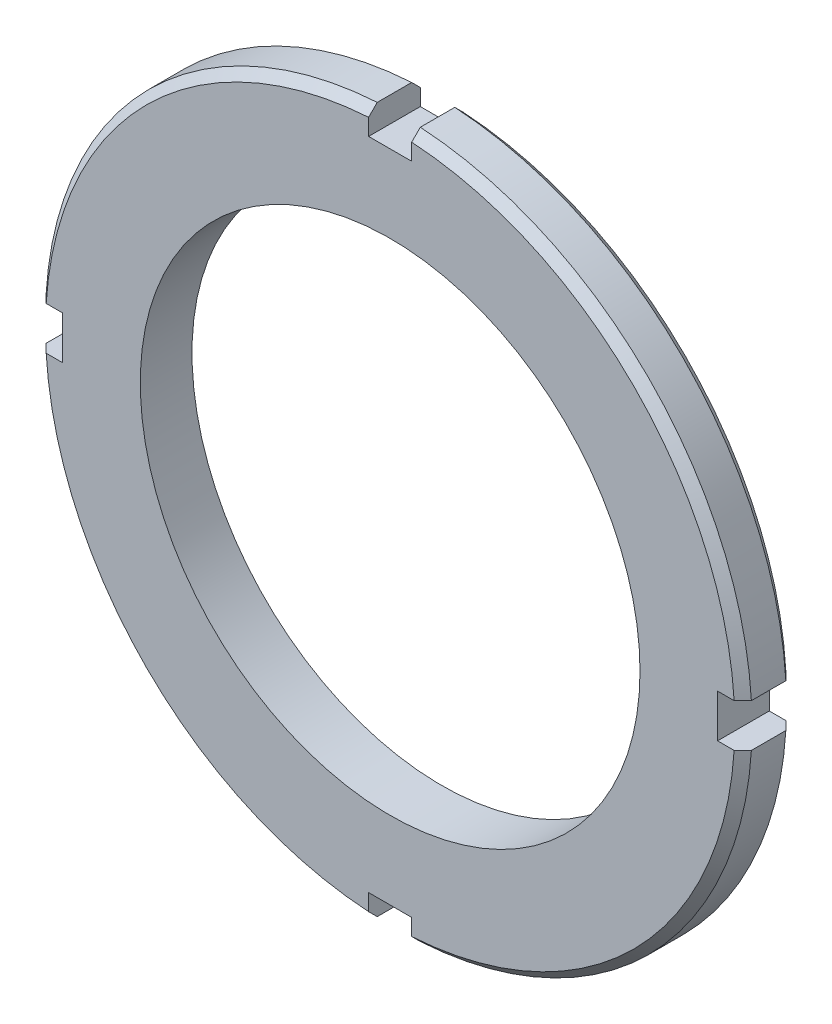
ISO-10303-21;
HEADER;
FILE_DESCRIPTION(('STEP AP214'),'2;1');
FILE_NAME('part.step','',(''),(''),'','','');
FILE_SCHEMA(('AUTOMOTIVE_DESIGN { 1 0 10303 214 1 1 1 1 }'));
ENDSEC;
DATA;
#1=APPLICATION_CONTEXT('core data for automotive mechanical design processes');
#2=APPLICATION_PROTOCOL_DEFINITION('international standard','automotive_design',2000,#1);
#3=PRODUCT_CONTEXT('',#1,'mechanical');
#4=PRODUCT('Part','Part','',(#3));
#5=PRODUCT_RELATED_PRODUCT_CATEGORY('part','',(#4));
#6=PRODUCT_DEFINITION_FORMATION('','',#4);
#7=PRODUCT_DEFINITION_CONTEXT('part definition',#1,'design');
#8=PRODUCT_DEFINITION('design','',#6,#7);
#9=PRODUCT_DEFINITION_SHAPE('','',#8);
#10=(LENGTH_UNIT() NAMED_UNIT(*) SI_UNIT(.MILLI.,.METRE.));
#11=(NAMED_UNIT(*) PLANE_ANGLE_UNIT() SI_UNIT($,.RADIAN.));
#12=(NAMED_UNIT(*) SI_UNIT($,.STERADIAN.) SOLID_ANGLE_UNIT());
#13=UNCERTAINTY_MEASURE_WITH_UNIT(LENGTH_MEASURE(1.E-05),#10,'distance_accuracy_value','');
#14=(GEOMETRIC_REPRESENTATION_CONTEXT(3) GLOBAL_UNCERTAINTY_ASSIGNED_CONTEXT((#13)) GLOBAL_UNIT_ASSIGNED_CONTEXT((#10,
#11,#12)) REPRESENTATION_CONTEXT('',''));
#15=CARTESIAN_POINT('',(0.,0.,0.));
#16=DIRECTION('',(0.,0.,1.));
#17=DIRECTION('',(1.,0.,0.));
#18=AXIS2_PLACEMENT_3D('',#15,#16,#17);
#19=CARTESIAN_POINT('',(0.,0.,6.));
#20=DIRECTION('',(0.,0.,-1.));
#21=DIRECTION('',(-1.,0.,0.));
#22=AXIS2_PLACEMENT_3D('',#19,#20,#21);
#23=CYLINDRICAL_SURFACE('',#22,41.);
#24=CARTESIAN_POINT('',(0.,0.,0.999999999999994));
#25=DIRECTION('',(0.,0.,1.));
#26=DIRECTION('',(1.,0.,0.));
#27=AXIS2_PLACEMENT_3D('',#24,#25,#26);
#28=CIRCLE('',#27,41.);
#29=CARTESIAN_POINT('',(40.9237095092808,2.5,0.999999999999994));
#30=VERTEX_POINT('',#29);
#31=CARTESIAN_POINT('',(2.49999999999986,40.9237095092808,0.999999999999994));
#32=VERTEX_POINT('',#31);
#33=EDGE_CURVE('E513',#30,#32,#28,.T.);
#34=ORIENTED_EDGE('',*,*,#33,.T.);
#35=DIRECTION('',(0.,0.,-1.));
#36=VECTOR('',#35,1.);
#37=CARTESIAN_POINT('',(2.49999999999986,40.9237095092808,6.));
#38=LINE('',#37,#36);
#39=CARTESIAN_POINT('',(2.49999999999986,40.9237095092808,5.00000000000001));
#40=VERTEX_POINT('',#39);
#41=EDGE_CURVE('E806',#32,#40,#38,.F.);
#42=ORIENTED_EDGE('',*,*,#41,.T.);
#43=CARTESIAN_POINT('',(0.,0.,5.00000000000001));
#44=DIRECTION('',(0.,0.,1.));
#45=DIRECTION('',(1.,0.,0.));
#46=AXIS2_PLACEMENT_3D('',#43,#44,#45);
#47=CIRCLE('',#46,41.);
#48=CARTESIAN_POINT('',(40.9237095092808,2.5,5.00000000000001));
#49=VERTEX_POINT('',#48);
#50=EDGE_CURVE('E507',#40,#49,#47,.F.);
#51=ORIENTED_EDGE('',*,*,#50,.T.);
#52=DIRECTION('',(0.,0.,-1.));
#53=VECTOR('',#52,1.);
#54=CARTESIAN_POINT('',(40.9237095092808,2.5,6.));
#55=LINE('',#54,#53);
#56=EDGE_CURVE('E487',#49,#30,#55,.T.);
#57=ORIENTED_EDGE('',*,*,#56,.T.);
#58=EDGE_LOOP('',(#34,#42,#51,#57));
#59=FACE_BOUND('',#58,.T.);
#60=ADVANCED_FACE('F53',(#59),#23,.T.);
#61=CARTESIAN_POINT('',(-40.9237095092808,2.5,5.00000000000001));
#62=VERTEX_POINT('',#61);
#63=CARTESIAN_POINT('',(-2.50000000000014,40.9237095092808,5.00000000000001));
#64=VERTEX_POINT('',#63);
#65=EDGE_CURVE('E841',#62,#64,#47,.F.);
#66=ORIENTED_EDGE('',*,*,#65,.T.);
#67=DIRECTION('',(0.,0.,-1.));
#68=VECTOR('',#67,1.);
#69=CARTESIAN_POINT('',(-2.50000000000014,40.9237095092808,6.));
#70=LINE('',#69,#68);
#71=CARTESIAN_POINT('',(-2.50000000000014,40.9237095092808,0.999999999999994));
#72=VERTEX_POINT('',#71);
#73=EDGE_CURVE('E76',#64,#72,#70,.T.);
#74=ORIENTED_EDGE('',*,*,#73,.T.);
#75=CARTESIAN_POINT('',(-40.9237095092808,2.5,0.999999999999994));
#76=VERTEX_POINT('',#75);
#77=EDGE_CURVE('E517',#72,#76,#28,.T.);
#78=ORIENTED_EDGE('',*,*,#77,.T.);
#79=DIRECTION('',(0.,0.,-1.));
#80=VECTOR('',#79,1.);
#81=CARTESIAN_POINT('',(-40.9237095092808,2.5,6.));
#82=LINE('',#81,#80);
#83=EDGE_CURVE('E405',#76,#62,#82,.F.);
#84=ORIENTED_EDGE('',*,*,#83,.T.);
#85=EDGE_LOOP('',(#66,#74,#78,#84));
#86=FACE_BOUND('',#85,.T.);
#87=ADVANCED_FACE('F608',(#86),#23,.T.);
#88=CARTESIAN_POINT('',(-2.49999999999957,-40.9237095092808,5.));
#89=VERTEX_POINT('',#88);
#90=CARTESIAN_POINT('',(-40.9237095092808,-2.5,5.00000000000001));
#91=VERTEX_POINT('',#90);
#92=EDGE_CURVE('E512',#89,#91,#47,.F.);
#93=ORIENTED_EDGE('',*,*,#92,.T.);
#94=DIRECTION('',(0.,0.,-1.));
#95=VECTOR('',#94,1.);
#96=CARTESIAN_POINT('',(-40.9237095092808,-2.5,6.));
#97=LINE('',#96,#95);
#98=CARTESIAN_POINT('',(-40.9237095092808,-2.5,0.999999999999994));
#99=VERTEX_POINT('',#98);
#100=EDGE_CURVE('E84',#91,#99,#97,.T.);
#101=ORIENTED_EDGE('',*,*,#100,.T.);
#102=CARTESIAN_POINT('',(-2.49999999999957,-40.9237095092808,0.999999999999994));
#103=VERTEX_POINT('',#102);
#104=EDGE_CURVE('E525',#99,#103,#28,.T.);
#105=ORIENTED_EDGE('',*,*,#104,.T.);
#106=DIRECTION('',(0.,0.,-1.));
#107=VECTOR('',#106,1.);
#108=CARTESIAN_POINT('',(-2.49999999999957,-40.9237095092808,6.));
#109=LINE('',#108,#107);
#110=EDGE_CURVE('E332',#103,#89,#109,.F.);
#111=ORIENTED_EDGE('',*,*,#110,.T.);
#112=EDGE_LOOP('',(#93,#101,#105,#111));
#113=FACE_BOUND('',#112,.T.);
#114=ADVANCED_FACE('F536',(#113),#23,.T.);
#115=CARTESIAN_POINT('',(0.,0.,0.999999999999994));
#116=DIRECTION('',(0.,0.,1.));
#117=DIRECTION('',(1.,0.,0.));
#118=AXIS2_PLACEMENT_3D('',#115,#116,#117);
#119=CONICAL_SURFACE('',#118,41.,0.785398163397452);
#120=CARTESIAN_POINT('',(2.49999999999985,44.0916594503413,4.16247766016836));
#121=CARTESIAN_POINT('',(2.49999999999985,42.8686945131576,2.94143846954862));
#122=CARTESIAN_POINT('',(2.49999999999986,41.6456231286787,1.72050593129695));
#123=CARTESIAN_POINT('',(2.49999999999986,39.1992674634485,-0.72114584214892));
#124=CARTESIAN_POINT('',(2.49999999999987,37.975983182697,-1.94186507734283));
#125=CARTESIAN_POINT('',(2.49999999999987,36.75259245465,-3.16247766016837));
#126=B_SPLINE_CURVE_WITH_KNOTS('',3,(#120,#121,#122,#123,#124,#125),.UNSPECIFIED.,.F.,.F.,(4,2,
4),(0.,5.18451722636114,10.3690344598512),.UNSPECIFIED.);
#127=CARTESIAN_POINT('',(2.49999999999986,39.9217985566783,0.));
#128=VERTEX_POINT('',#127);
#129=EDGE_CURVE('E797',#32,#128,#126,.T.);
#130=ORIENTED_EDGE('',*,*,#129,.F.);
#131=ORIENTED_EDGE('',*,*,#33,.F.);
#132=CARTESIAN_POINT('',(36.7525924546499,2.5,-3.16247766016838));
#133=CARTESIAN_POINT('',(37.975983182697,2.5,-1.94186507734283));
#134=CARTESIAN_POINT('',(39.1992674634485,2.5,-0.72114584214892));
#135=CARTESIAN_POINT('',(41.6456231286787,2.5,1.72050593129696));
#136=CARTESIAN_POINT('',(42.8686945131576,2.5,2.94143846954862));
#137=CARTESIAN_POINT('',(44.0916594503413,2.5,4.16247766016837));
#138=B_SPLINE_CURVE_WITH_KNOTS('',3,(#132,#133,#134,#135,#136,#137),.UNSPECIFIED.,.F.,.F.,(4,2,
4),(0.,5.18451723349012,10.3690344598513),.UNSPECIFIED.);
#139=CARTESIAN_POINT('',(39.9217985566783,2.5,0.));
#140=VERTEX_POINT('',#139);
#141=EDGE_CURVE('E478',#140,#30,#138,.T.);
#142=ORIENTED_EDGE('',*,*,#141,.F.);
#143=CARTESIAN_POINT('',(0.,0.,0.));
#144=DIRECTION('',(0.,0.,1.));
#145=DIRECTION('',(1.,0.,0.));
#146=AXIS2_PLACEMENT_3D('',#143,#144,#145);
#147=CIRCLE('',#146,40.);
#148=EDGE_CURVE('E516',#128,#140,#147,.F.);
#149=ORIENTED_EDGE('',*,*,#148,.F.);
#150=EDGE_LOOP('',(#130,#131,#142,#149));
#151=FACE_BOUND('',#150,.T.);
#152=ADVANCED_FACE('F596',(#151),#119,.T.);
#153=CARTESIAN_POINT('',(-2.50000000000013,36.7525924546499,-3.16247766016838));
#154=CARTESIAN_POINT('',(-2.50000000000013,37.975983182697,-1.94186507734284));
#155=CARTESIAN_POINT('',(-2.50000000000014,39.1992674634485,-0.721145842148923));
#156=CARTESIAN_POINT('',(-2.50000000000014,41.6456231286787,1.72050593129695));
#157=CARTESIAN_POINT('',(-2.50000000000015,42.8686945131576,2.94143846954862));
#158=CARTESIAN_POINT('',(-2.50000000000015,44.0916594503413,4.16247766016837));
#159=B_SPLINE_CURVE_WITH_KNOTS('',3,(#153,#154,#155,#156,#157,#158),.UNSPECIFIED.,.F.,.F.,(4,2,
4),(0.,5.18451723349012,10.3690344598513),.UNSPECIFIED.);
#160=CARTESIAN_POINT('',(-2.50000000000014,39.9217985566783,0.));
#161=VERTEX_POINT('',#160);
#162=EDGE_CURVE('E564',#161,#72,#159,.T.);
#163=ORIENTED_EDGE('',*,*,#162,.F.);
#164=CARTESIAN_POINT('',(-39.9217985566783,2.5,0.));
#165=VERTEX_POINT('',#164);
#166=EDGE_CURVE('E247',#165,#161,#147,.F.);
#167=ORIENTED_EDGE('',*,*,#166,.F.);
#168=CARTESIAN_POINT('',(-44.0916594503413,2.5,4.16247766016837));
#169=CARTESIAN_POINT('',(-42.8686945131576,2.5,2.94143846954862));
#170=CARTESIAN_POINT('',(-41.6456231286787,2.5,1.72050593129696));
#171=CARTESIAN_POINT('',(-39.1992674634485,2.5,-0.721145842148919));
#172=CARTESIAN_POINT('',(-37.975983182697,2.5,-1.94186507734283));
#173=CARTESIAN_POINT('',(-36.7525924546499,2.5,-3.16247766016837));
#174=B_SPLINE_CURVE_WITH_KNOTS('',3,(#168,#169,#170,#171,#172,#173),.UNSPECIFIED.,.F.,.F.,(4,2,
4),(0.,5.18451722636115,10.3690344598513),.UNSPECIFIED.);
#175=EDGE_CURVE('E409',#76,#165,#174,.T.);
#176=ORIENTED_EDGE('',*,*,#175,.F.);
#177=ORIENTED_EDGE('',*,*,#77,.F.);
#178=EDGE_LOOP('',(#163,#167,#176,#177));
#179=FACE_BOUND('',#178,.T.);
#180=ADVANCED_FACE('F562',(#179),#119,.T.);
#181=CARTESIAN_POINT('',(-36.7525924546499,-2.5,-3.16247766016838));
#182=CARTESIAN_POINT('',(-37.975983182697,-2.5,-1.94186507734284));
#183=CARTESIAN_POINT('',(-39.1992674634485,-2.5,-0.721145842148921));
#184=CARTESIAN_POINT('',(-41.6456231286787,-2.5,1.72050593129696));
#185=CARTESIAN_POINT('',(-42.8686945131576,-2.5,2.94143846954863));
#186=CARTESIAN_POINT('',(-44.0916594503413,-2.5,4.16247766016837));
#187=B_SPLINE_CURVE_WITH_KNOTS('',3,(#181,#182,#183,#184,#185,#186),.UNSPECIFIED.,.F.,.F.,(4,2,
4),(0.,5.18451723349013,10.3690344598513),.UNSPECIFIED.);
#188=CARTESIAN_POINT('',(-39.9217985566783,-2.5,0.));
#189=VERTEX_POINT('',#188);
#190=EDGE_CURVE('E398',#189,#99,#187,.T.);
#191=ORIENTED_EDGE('',*,*,#190,.F.);
#192=CARTESIAN_POINT('',(-2.49999999999958,-39.9217985566783,0.));
#193=VERTEX_POINT('',#192);
#194=EDGE_CURVE('E544',#193,#189,#147,.F.);
#195=ORIENTED_EDGE('',*,*,#194,.F.);
#196=CARTESIAN_POINT('',(-2.49999999999954,-44.0916594503413,4.16247766016835));
#197=CARTESIAN_POINT('',(-2.49999999999955,-42.8686945131576,2.94143846954861));
#198=CARTESIAN_POINT('',(-2.49999999999957,-41.6456231286787,1.72050593129695));
#199=CARTESIAN_POINT('',(-2.49999999999959,-39.1992674634486,-0.721145842148912));
#200=CARTESIAN_POINT('',(-2.4999999999996,-37.975983182697,-1.94186507734282));
#201=CARTESIAN_POINT('',(-2.49999999999962,-36.75259245465,-3.16247766016835));
#202=B_SPLINE_CURVE_WITH_KNOTS('',3,(#196,#197,#198,#199,#200,#201),.UNSPECIFIED.,.F.,.F.,(4,2,
4),(0.,5.18451722636112,10.3690344598512),.UNSPECIFIED.);
#203=EDGE_CURVE('E389',#103,#193,#202,.T.);
#204=ORIENTED_EDGE('',*,*,#203,.F.);
#205=ORIENTED_EDGE('',*,*,#104,.F.);
#206=EDGE_LOOP('',(#191,#195,#204,#205));
#207=FACE_BOUND('',#206,.T.);
#208=ADVANCED_FACE('F541',(#207),#119,.T.);
#209=CARTESIAN_POINT('',(0.,0.,6.));
#210=DIRECTION('',(0.,0.,-1.));
#211=DIRECTION('',(-1.,0.,0.));
#212=AXIS2_PLACEMENT_3D('',#209,#210,#211);
#213=CONICAL_SURFACE('',#212,40.,0.785398163397445);
#214=CARTESIAN_POINT('',(2.49999999999987,36.75259245465,9.16247766016837));
#215=CARTESIAN_POINT('',(2.49999999999987,37.975983182697,7.94186507734283));
#216=CARTESIAN_POINT('',(2.49999999999986,39.1992674634486,6.72114584214892));
#217=CARTESIAN_POINT('',(2.49999999999986,41.6456231286787,4.27949406870305));
#218=CARTESIAN_POINT('',(2.49999999999985,42.8686945131576,3.05856153045138));
#219=CARTESIAN_POINT('',(2.49999999999985,44.0916594503413,1.83752233983163));
#220=B_SPLINE_CURVE_WITH_KNOTS('',3,(#214,#215,#216,#217,#218,#219),.UNSPECIFIED.,.F.,.F.,(4,2,
4),(0.,5.18451723349008,10.3690344598512),.UNSPECIFIED.);
#221=CARTESIAN_POINT('',(2.49999999999986,39.9217985566783,6.));
#222=VERTEX_POINT('',#221);
#223=EDGE_CURVE('E11',#222,#40,#220,.T.);
#224=ORIENTED_EDGE('',*,*,#223,.F.);
#225=CARTESIAN_POINT('',(0.,0.,6.));
#226=DIRECTION('',(0.,0.,1.));
#227=DIRECTION('',(1.,0.,0.));
#228=AXIS2_PLACEMENT_3D('',#225,#226,#227);
#229=CIRCLE('',#228,40.);
#230=CARTESIAN_POINT('',(39.9217985566783,2.5,6.));
#231=VERTEX_POINT('',#230);
#232=EDGE_CURVE('E451',#231,#222,#229,.T.);
#233=ORIENTED_EDGE('',*,*,#232,.F.);
#234=CARTESIAN_POINT('',(44.0916594503413,2.5,1.83752233983163));
#235=CARTESIAN_POINT('',(42.8686945131576,2.5,3.05856153045138));
#236=CARTESIAN_POINT('',(41.6456231286787,2.5,4.27949406870305));
#237=CARTESIAN_POINT('',(39.1992674634485,2.5,6.72114584214892));
#238=CARTESIAN_POINT('',(37.975983182697,2.5,7.94186507734284));
#239=CARTESIAN_POINT('',(36.75259245465,2.5,9.16247766016838));
#240=B_SPLINE_CURVE_WITH_KNOTS('',3,(#234,#235,#236,#237,#238,#239),.UNSPECIFIED.,.F.,.F.,(4,2,
4),(0.,5.18451722636112,10.3690344598512),.UNSPECIFIED.);
#241=EDGE_CURVE('E457',#49,#231,#240,.T.);
#242=ORIENTED_EDGE('',*,*,#241,.F.);
#243=ORIENTED_EDGE('',*,*,#50,.F.);
#244=EDGE_LOOP('',(#224,#233,#242,#243));
#245=FACE_BOUND('',#244,.T.);
#246=ADVANCED_FACE('F601',(#245),#213,.T.);
#247=CARTESIAN_POINT('',(-2.50000000000015,44.0916594503413,1.83752233983163));
#248=CARTESIAN_POINT('',(-2.50000000000015,42.8686945131576,3.05856153045138));
#249=CARTESIAN_POINT('',(-2.50000000000014,41.6456231286787,4.27949406870304));
#250=CARTESIAN_POINT('',(-2.50000000000014,39.1992674634485,6.72114584214892));
#251=CARTESIAN_POINT('',(-2.50000000000013,37.975983182697,7.94186507734284));
#252=CARTESIAN_POINT('',(-2.50000000000013,36.75259245465,9.16247766016838));
#253=B_SPLINE_CURVE_WITH_KNOTS('',3,(#247,#248,#249,#250,#251,#252),.UNSPECIFIED.,.F.,.F.,(4,2,
4),(0.,5.18451722636112,10.3690344598512),.UNSPECIFIED.);
#254=CARTESIAN_POINT('',(-2.50000000000014,39.9217985566783,6.));
#255=VERTEX_POINT('',#254);
#256=EDGE_CURVE('E69',#64,#255,#253,.T.);
#257=ORIENTED_EDGE('',*,*,#256,.F.);
#258=ORIENTED_EDGE('',*,*,#65,.F.);
#259=CARTESIAN_POINT('',(-36.75259245465,2.5,9.16247766016838));
#260=CARTESIAN_POINT('',(-37.975983182697,2.5,7.94186507734284));
#261=CARTESIAN_POINT('',(-39.1992674634485,2.5,6.72114584214892));
#262=CARTESIAN_POINT('',(-41.6456231286787,2.5,4.27949406870305));
#263=CARTESIAN_POINT('',(-42.8686945131576,2.5,3.05856153045138));
#264=CARTESIAN_POINT('',(-44.0916594503413,2.5,1.83752233983163));
#265=B_SPLINE_CURVE_WITH_KNOTS('',3,(#259,#260,#261,#262,#263,#264),.UNSPECIFIED.,.F.,.F.,(4,2,
4),(0.,5.18451723349009,10.3690344598512),.UNSPECIFIED.);
#266=CARTESIAN_POINT('',(-39.9217985566783,2.5,6.));
#267=VERTEX_POINT('',#266);
#268=EDGE_CURVE('E426',#267,#62,#265,.T.);
#269=ORIENTED_EDGE('',*,*,#268,.F.);
#270=EDGE_CURVE('E447',#255,#267,#229,.T.);
#271=ORIENTED_EDGE('',*,*,#270,.F.);
#272=EDGE_LOOP('',(#257,#258,#269,#271));
#273=FACE_BOUND('',#272,.T.);
#274=ADVANCED_FACE('F449',(#273),#213,.T.);
#275=CARTESIAN_POINT('',(-44.0916594503413,-2.5,1.83752233983163));
#276=CARTESIAN_POINT('',(-42.8686945131576,-2.5,3.05856153045138));
#277=CARTESIAN_POINT('',(-41.6456231286787,-2.5,4.27949406870305));
#278=CARTESIAN_POINT('',(-39.1992674634485,-2.5,6.72114584214892));
#279=CARTESIAN_POINT('',(-37.975983182697,-2.5,7.94186507734284));
#280=CARTESIAN_POINT('',(-36.75259245465,-2.5,9.16247766016838));
#281=B_SPLINE_CURVE_WITH_KNOTS('',3,(#275,#276,#277,#278,#279,#280),.UNSPECIFIED.,.F.,.F.,(4,2,
4),(0.,5.18451722636112,10.3690344598512),.UNSPECIFIED.);
#282=CARTESIAN_POINT('',(-39.9217985566783,-2.5,6.));
#283=VERTEX_POINT('',#282);
#284=EDGE_CURVE('E373',#91,#283,#281,.T.);
#285=ORIENTED_EDGE('',*,*,#284,.F.);
#286=ORIENTED_EDGE('',*,*,#92,.F.);
#287=CARTESIAN_POINT('',(-2.49999999999962,-36.75259245465,9.16247766016835));
#288=CARTESIAN_POINT('',(-2.4999999999996,-37.9759831826971,7.94186507734282));
#289=CARTESIAN_POINT('',(-2.49999999999959,-39.1992674634486,6.72114584214891));
#290=CARTESIAN_POINT('',(-2.49999999999957,-41.6456231286787,4.27949406870305));
#291=CARTESIAN_POINT('',(-2.49999999999955,-42.8686945131576,3.05856153045139));
#292=CARTESIAN_POINT('',(-2.49999999999954,-44.0916594503413,1.83752233983165));
#293=B_SPLINE_CURVE_WITH_KNOTS('',3,(#287,#288,#289,#290,#291,#292),.UNSPECIFIED.,.F.,.F.,(4,2,
4),(0.,5.18451723349005,10.3690344598511),.UNSPECIFIED.);
#294=CARTESIAN_POINT('',(-2.49999999999958,-39.9217985566783,6.));
#295=VERTEX_POINT('',#294);
#296=EDGE_CURVE('E360',#295,#89,#293,.T.);
#297=ORIENTED_EDGE('',*,*,#296,.F.);
#298=EDGE_CURVE('E452',#283,#295,#229,.T.);
#299=ORIENTED_EDGE('',*,*,#298,.F.);
#300=EDGE_LOOP('',(#285,#286,#297,#299));
#301=FACE_BOUND('',#300,.T.);
#302=ADVANCED_FACE('F554',(#301),#213,.T.);
#303=CARTESIAN_POINT('',(40.9237095092808,-2.5,5.00000000000001));
#304=VERTEX_POINT('',#303);
#305=CARTESIAN_POINT('',(2.50000000000043,-40.9237095092808,5.00000000000001));
#306=VERTEX_POINT('',#305);
#307=EDGE_CURVE('E508',#304,#306,#47,.F.);
#308=ORIENTED_EDGE('',*,*,#307,.T.);
#309=DIRECTION('',(0.,0.,-1.));
#310=VECTOR('',#309,1.);
#311=CARTESIAN_POINT('',(2.50000000000043,-40.9237095092808,6.));
#312=LINE('',#311,#310);
#313=CARTESIAN_POINT('',(2.50000000000043,-40.9237095092808,0.999999999999994));
#314=VERTEX_POINT('',#313);
#315=EDGE_CURVE('E263',#306,#314,#312,.T.);
#316=ORIENTED_EDGE('',*,*,#315,.T.);
#317=CARTESIAN_POINT('',(40.9237095092808,-2.5,0.999999999999994));
#318=VERTEX_POINT('',#317);
#319=EDGE_CURVE('E511',#314,#318,#28,.T.);
#320=ORIENTED_EDGE('',*,*,#319,.T.);
#321=DIRECTION('',(0.,0.,-1.));
#322=VECTOR('',#321,1.);
#323=CARTESIAN_POINT('',(40.9237095092808,-2.5,6.));
#324=LINE('',#323,#322);
#325=EDGE_CURVE('E486',#318,#304,#324,.F.);
#326=ORIENTED_EDGE('',*,*,#325,.T.);
#327=EDGE_LOOP('',(#308,#316,#320,#326));
#328=FACE_BOUND('',#327,.T.);
#329=ADVANCED_FACE('F591',(#328),#23,.T.);
#330=CARTESIAN_POINT('',(0.,0.,6.));
#331=DIRECTION('',(0.,0.,1.));
#332=DIRECTION('',(1.,0.,0.));
#333=AXIS2_PLACEMENT_3D('',#330,#331,#332);
#334=PLANE('',#333);
#335=DIRECTION('',(0.,1.,0.));
#336=VECTOR('',#335,1.);
#337=CARTESIAN_POINT('',(2.49999999999987,38.,6.));
#338=LINE('',#337,#336);
#339=CARTESIAN_POINT('',(2.49999999999987,38.,6.));
#340=VERTEX_POINT('',#339);
#341=EDGE_CURVE('E249',#340,#222,#338,.T.);
#342=ORIENTED_EDGE('',*,*,#341,.F.);
#343=DIRECTION('',(1.,0.,0.));
#344=VECTOR('',#343,1.);
#345=CARTESIAN_POINT('',(2.49999999999987,38.,6.));
#346=LINE('',#345,#344);
#347=CARTESIAN_POINT('',(-2.50000000000013,38.,6.));
#348=VERTEX_POINT('',#347);
#349=EDGE_CURVE('E252',#348,#340,#346,.T.);
#350=ORIENTED_EDGE('',*,*,#349,.F.);
#351=DIRECTION('',(0.,-1.,0.));
#352=VECTOR('',#351,1.);
#353=CARTESIAN_POINT('',(-2.50000000000013,38.,6.));
#354=LINE('',#353,#352);
#355=EDGE_CURVE('E226',#255,#348,#354,.T.);
#356=ORIENTED_EDGE('',*,*,#355,.F.);
#357=ORIENTED_EDGE('',*,*,#270,.T.);
#358=DIRECTION('',(-1.,0.,0.));
#359=VECTOR('',#358,1.);
#360=CARTESIAN_POINT('',(-38.,2.5,6.));
#361=LINE('',#360,#359);
#362=CARTESIAN_POINT('',(-38.,2.5,6.));
#363=VERTEX_POINT('',#362);
#364=EDGE_CURVE('E270',#363,#267,#361,.T.);
#365=ORIENTED_EDGE('',*,*,#364,.F.);
#366=DIRECTION('',(0.,1.,0.));
#367=VECTOR('',#366,1.);
#368=CARTESIAN_POINT('',(-38.,2.5,6.));
#369=LINE('',#368,#367);
#370=CARTESIAN_POINT('',(-38.,-2.5,6.));
#371=VERTEX_POINT('',#370);
#372=EDGE_CURVE('E281',#371,#363,#369,.T.);
#373=ORIENTED_EDGE('',*,*,#372,.F.);
#374=DIRECTION('',(1.,0.,0.));
#375=VECTOR('',#374,1.);
#376=CARTESIAN_POINT('',(-38.,-2.5,6.));
#377=LINE('',#376,#375);
#378=EDGE_CURVE('E278',#283,#371,#377,.T.);
#379=ORIENTED_EDGE('',*,*,#378,.F.);
#380=ORIENTED_EDGE('',*,*,#298,.T.);
#381=DIRECTION('',(0.,-1.,0.));
#382=VECTOR('',#381,1.);
#383=CARTESIAN_POINT('',(-2.4999999999996,-38.,6.));
#384=LINE('',#383,#382);
#385=CARTESIAN_POINT('',(-2.4999999999996,-38.,6.));
#386=VERTEX_POINT('',#385);
#387=EDGE_CURVE('E298',#386,#295,#384,.T.);
#388=ORIENTED_EDGE('',*,*,#387,.F.);
#389=DIRECTION('',(-1.,0.,0.));
#390=VECTOR('',#389,1.);
#391=CARTESIAN_POINT('',(-2.4999999999996,-38.,6.));
#392=LINE('',#391,#390);
#393=CARTESIAN_POINT('',(2.5000000000004,-38.,6.));
#394=VERTEX_POINT('',#393);
#395=EDGE_CURVE('E310',#394,#386,#392,.T.);
#396=ORIENTED_EDGE('',*,*,#395,.F.);
#397=DIRECTION('',(0.,1.,0.));
#398=VECTOR('',#397,1.);
#399=CARTESIAN_POINT('',(2.5000000000004,-38.,6.));
#400=LINE('',#399,#398);
#401=CARTESIAN_POINT('',(2.50000000000042,-39.9217985566783,6.));
#402=VERTEX_POINT('',#401);
#403=EDGE_CURVE('E307',#402,#394,#400,.T.);
#404=ORIENTED_EDGE('',*,*,#403,.F.);
#405=CARTESIAN_POINT('',(39.9217985566783,-2.5,6.));
#406=VERTEX_POINT('',#405);
#407=EDGE_CURVE('E458',#402,#406,#229,.T.);
#408=ORIENTED_EDGE('',*,*,#407,.T.);
#409=DIRECTION('',(1.,0.,0.));
#410=VECTOR('',#409,1.);
#411=CARTESIAN_POINT('',(38.,-2.5,6.));
#412=LINE('',#411,#410);
#413=CARTESIAN_POINT('',(38.,-2.5,6.));
#414=VERTEX_POINT('',#413);
#415=EDGE_CURVE('E576',#414,#406,#412,.T.);
#416=ORIENTED_EDGE('',*,*,#415,.F.);
#417=DIRECTION('',(0.,-1.,0.));
#418=VECTOR('',#417,1.);
#419=CARTESIAN_POINT('',(38.,-2.5,6.));
#420=LINE('',#419,#418);
#421=CARTESIAN_POINT('',(38.,2.5,6.));
#422=VERTEX_POINT('',#421);
#423=EDGE_CURVE('E586',#422,#414,#420,.T.);
#424=ORIENTED_EDGE('',*,*,#423,.F.);
#425=DIRECTION('',(-1.,0.,0.));
#426=VECTOR('',#425,1.);
#427=CARTESIAN_POINT('',(38.,2.5,6.));
#428=LINE('',#427,#426);
#429=EDGE_CURVE('E805',#231,#422,#428,.T.);
#430=ORIENTED_EDGE('',*,*,#429,.F.);
#431=ORIENTED_EDGE('',*,*,#232,.T.);
#432=EDGE_LOOP('',(#342,#350,#356,#357,#365,#373,#379,#380,#388,#396,#404,#408,#416,#424,#430,#431));
#433=FACE_BOUND('',#432,.T.);
#434=CARTESIAN_POINT('',(0.,0.,6.));
#435=DIRECTION('',(0.,0.,1.));
#436=DIRECTION('',(1.,0.,0.));
#437=AXIS2_PLACEMENT_3D('',#434,#435,#436);
#438=CIRCLE('',#437,29.);
#439=CARTESIAN_POINT('',(29.,0.,6.));
#440=VERTEX_POINT('',#439);
#441=EDGE_CURVE('E499',#440,#440,#438,.T.);
#442=ORIENTED_EDGE('',*,*,#441,.F.);
#443=EDGE_LOOP('',(#442));
#444=FACE_BOUND('',#443,.T.);
#445=ADVANCED_FACE('F444',(#433,#444),#334,.T.);
#446=CARTESIAN_POINT('',(0.,0.,0.));
#447=DIRECTION('',(0.,0.,1.));
#448=DIRECTION('',(1.,0.,0.));
#449=AXIS2_PLACEMENT_3D('',#446,#447,#448);
#450=PLANE('',#449);
#451=DIRECTION('',(1.,0.,0.));
#452=VECTOR('',#451,1.);
#453=CARTESIAN_POINT('',(2.49999999999987,38.,0.));
#454=LINE('',#453,#452);
#455=CARTESIAN_POINT('',(-2.50000000000013,38.,0.));
#456=VERTEX_POINT('',#455);
#457=CARTESIAN_POINT('',(2.49999999999987,38.,0.));
#458=VERTEX_POINT('',#457);
#459=EDGE_CURVE('E235',#456,#458,#454,.T.);
#460=ORIENTED_EDGE('',*,*,#459,.T.);
#461=DIRECTION('',(0.,1.,0.));
#462=VECTOR('',#461,1.);
#463=CARTESIAN_POINT('',(2.49999999999987,38.,0.));
#464=LINE('',#463,#462);
#465=EDGE_CURVE('E232',#458,#128,#464,.T.);
#466=ORIENTED_EDGE('',*,*,#465,.T.);
#467=ORIENTED_EDGE('',*,*,#148,.T.);
#468=DIRECTION('',(-1.,0.,0.));
#469=VECTOR('',#468,1.);
#470=CARTESIAN_POINT('',(38.,2.5,0.));
#471=LINE('',#470,#469);
#472=CARTESIAN_POINT('',(38.,2.5,0.));
#473=VERTEX_POINT('',#472);
#474=EDGE_CURVE('E585',#140,#473,#471,.T.);
#475=ORIENTED_EDGE('',*,*,#474,.T.);
#476=DIRECTION('',(0.,-1.,0.));
#477=VECTOR('',#476,1.);
#478=CARTESIAN_POINT('',(38.,-2.5,0.));
#479=LINE('',#478,#477);
#480=CARTESIAN_POINT('',(38.,-2.5,0.));
#481=VERTEX_POINT('',#480);
#482=EDGE_CURVE('E810',#473,#481,#479,.T.);
#483=ORIENTED_EDGE('',*,*,#482,.T.);
#484=DIRECTION('',(1.,0.,0.));
#485=VECTOR('',#484,1.);
#486=CARTESIAN_POINT('',(38.,-2.5,0.));
#487=LINE('',#486,#485);
#488=CARTESIAN_POINT('',(39.9217985566783,-2.5,0.));
#489=VERTEX_POINT('',#488);
#490=EDGE_CURVE('E814',#481,#489,#487,.T.);
#491=ORIENTED_EDGE('',*,*,#490,.T.);
#492=CARTESIAN_POINT('',(2.50000000000042,-39.9217985566782,0.));
#493=VERTEX_POINT('',#492);
#494=EDGE_CURVE('E461',#489,#493,#147,.F.);
#495=ORIENTED_EDGE('',*,*,#494,.T.);
#496=DIRECTION('',(0.,1.,0.));
#497=VECTOR('',#496,1.);
#498=CARTESIAN_POINT('',(2.5000000000004,-38.,0.));
#499=LINE('',#498,#497);
#500=CARTESIAN_POINT('',(2.5000000000004,-38.,0.));
#501=VERTEX_POINT('',#500);
#502=EDGE_CURVE('E293',#493,#501,#499,.T.);
#503=ORIENTED_EDGE('',*,*,#502,.T.);
#504=DIRECTION('',(-1.,0.,0.));
#505=VECTOR('',#504,1.);
#506=CARTESIAN_POINT('',(-2.4999999999996,-38.,0.));
#507=LINE('',#506,#505);
#508=CARTESIAN_POINT('',(-2.4999999999996,-38.,0.));
#509=VERTEX_POINT('',#508);
#510=EDGE_CURVE('E297',#501,#509,#507,.T.);
#511=ORIENTED_EDGE('',*,*,#510,.T.);
#512=DIRECTION('',(0.,-1.,0.));
#513=VECTOR('',#512,1.);
#514=CARTESIAN_POINT('',(-2.4999999999996,-38.,0.));
#515=LINE('',#514,#513);
#516=EDGE_CURVE('E302',#509,#193,#515,.T.);
#517=ORIENTED_EDGE('',*,*,#516,.T.);
#518=ORIENTED_EDGE('',*,*,#194,.T.);
#519=DIRECTION('',(1.,0.,0.));
#520=VECTOR('',#519,1.);
#521=CARTESIAN_POINT('',(-38.,-2.5,0.));
#522=LINE('',#521,#520);
#523=CARTESIAN_POINT('',(-38.,-2.5,0.));
#524=VERTEX_POINT('',#523);
#525=EDGE_CURVE('E265',#189,#524,#522,.T.);
#526=ORIENTED_EDGE('',*,*,#525,.T.);
#527=DIRECTION('',(0.,1.,0.));
#528=VECTOR('',#527,1.);
#529=CARTESIAN_POINT('',(-38.,2.5,0.));
#530=LINE('',#529,#528);
#531=CARTESIAN_POINT('',(-38.,2.5,0.));
#532=VERTEX_POINT('',#531);
#533=EDGE_CURVE('E269',#524,#532,#530,.T.);
#534=ORIENTED_EDGE('',*,*,#533,.T.);
#535=DIRECTION('',(-1.,0.,0.));
#536=VECTOR('',#535,1.);
#537=CARTESIAN_POINT('',(-38.,2.5,0.));
#538=LINE('',#537,#536);
#539=EDGE_CURVE('E274',#532,#165,#538,.T.);
#540=ORIENTED_EDGE('',*,*,#539,.T.);
#541=ORIENTED_EDGE('',*,*,#166,.T.);
#542=DIRECTION('',(0.,-1.,0.));
#543=VECTOR('',#542,1.);
#544=CARTESIAN_POINT('',(-2.50000000000013,38.,0.));
#545=LINE('',#544,#543);
#546=EDGE_CURVE('E223',#161,#456,#545,.T.);
#547=ORIENTED_EDGE('',*,*,#546,.T.);
#548=EDGE_LOOP('',(#460,#466,#467,#475,#483,#491,#495,#503,#511,#517,#518,#526,#534,#540,#541,#547));
#549=FACE_BOUND('',#548,.T.);
#550=CARTESIAN_POINT('',(0.,0.,0.));
#551=DIRECTION('',(0.,0.,1.));
#552=DIRECTION('',(1.,0.,0.));
#553=AXIS2_PLACEMENT_3D('',#550,#551,#552);
#554=CIRCLE('',#553,29.);
#555=CARTESIAN_POINT('',(29.,0.,0.));
#556=VERTEX_POINT('',#555);
#557=EDGE_CURVE('E503',#556,#556,#554,.T.);
#558=ORIENTED_EDGE('',*,*,#557,.T.);
#559=EDGE_LOOP('',(#558));
#560=FACE_BOUND('',#559,.T.);
#561=ADVANCED_FACE('F243',(#549,#560),#450,.F.);
#562=CARTESIAN_POINT('',(0.,0.,6.));
#563=DIRECTION('',(0.,0.,1.));
#564=DIRECTION('',(1.,0.,0.));
#565=AXIS2_PLACEMENT_3D('',#562,#563,#564);
#566=CYLINDRICAL_SURFACE('',#565,29.);
#567=ORIENTED_EDGE('',*,*,#557,.F.);
#568=EDGE_LOOP('',(#567));
#569=FACE_BOUND('',#568,.T.);
#570=ORIENTED_EDGE('',*,*,#441,.T.);
#571=EDGE_LOOP('',(#570));
#572=FACE_BOUND('',#571,.T.);
#573=ADVANCED_FACE('F474',(#569,#572),#566,.F.);
#574=CARTESIAN_POINT('',(2.50000000000038,-36.7525924546499,-3.16247766016838));
#575=CARTESIAN_POINT('',(2.5000000000004,-37.9759831826969,-1.94186507734283));
#576=CARTESIAN_POINT('',(2.50000000000041,-39.1992674634485,-0.72114584214892));
#577=CARTESIAN_POINT('',(2.50000000000044,-41.6456231286787,1.72050593129696));
#578=CARTESIAN_POINT('',(2.50000000000045,-42.8686945131576,2.94143846954862));
#579=CARTESIAN_POINT('',(2.50000000000046,-44.0916594503413,4.16247766016837));
#580=B_SPLINE_CURVE_WITH_KNOTS('',3,(#574,#575,#576,#577,#578,#579),.UNSPECIFIED.,.F.,.F.,(4,2,
4),(0.,5.18451723349012,10.3690344598513),.UNSPECIFIED.);
#581=EDGE_CURVE('E324',#493,#314,#580,.T.);
#582=ORIENTED_EDGE('',*,*,#581,.F.);
#583=ORIENTED_EDGE('',*,*,#494,.F.);
#584=CARTESIAN_POINT('',(44.0916594503413,-2.5,4.16247766016837));
#585=CARTESIAN_POINT('',(42.8686945131576,-2.5,2.94143846954862));
#586=CARTESIAN_POINT('',(41.6456231286787,-2.5,1.72050593129695));
#587=CARTESIAN_POINT('',(39.1992674634485,-2.5,-0.721145842148924));
#588=CARTESIAN_POINT('',(37.975983182697,-2.5,-1.94186507734284));
#589=CARTESIAN_POINT('',(36.7525924546499,-2.5,-3.16247766016839));
#590=B_SPLINE_CURVE_WITH_KNOTS('',3,(#584,#585,#586,#587,#588,#589),.UNSPECIFIED.,.F.,.F.,(4,2,
4),(0.,5.18451722636115,10.3690344598513),.UNSPECIFIED.);
#591=EDGE_CURVE('E492',#318,#489,#590,.T.);
#592=ORIENTED_EDGE('',*,*,#591,.F.);
#593=ORIENTED_EDGE('',*,*,#319,.F.);
#594=EDGE_LOOP('',(#582,#583,#592,#593));
#595=FACE_BOUND('',#594,.T.);
#596=ADVANCED_FACE('F335',(#595),#119,.T.);
#597=CARTESIAN_POINT('',(2.50000000000046,-44.0916594503412,1.83752233983163));
#598=CARTESIAN_POINT('',(2.50000000000045,-42.8686945131575,3.05856153045138));
#599=CARTESIAN_POINT('',(2.50000000000044,-41.6456231286786,4.27949406870305));
#600=CARTESIAN_POINT('',(2.50000000000041,-39.1992674634485,6.72114584214892));
#601=CARTESIAN_POINT('',(2.5000000000004,-37.975983182697,7.94186507734284));
#602=CARTESIAN_POINT('',(2.50000000000038,-36.75259245465,9.16247766016838));
#603=B_SPLINE_CURVE_WITH_KNOTS('',3,(#597,#598,#599,#600,#601,#602),.UNSPECIFIED.,.F.,.F.,(4,2,
4),(0.,5.18451722636112,10.3690344598512),.UNSPECIFIED.);
#604=EDGE_CURVE('E352',#306,#402,#603,.T.);
#605=ORIENTED_EDGE('',*,*,#604,.F.);
#606=ORIENTED_EDGE('',*,*,#307,.F.);
#607=CARTESIAN_POINT('',(36.75259245465,-2.5,9.16247766016838));
#608=CARTESIAN_POINT('',(37.975983182697,-2.5,7.94186507734284));
#609=CARTESIAN_POINT('',(39.1992674634485,-2.5,6.72114584214892));
#610=CARTESIAN_POINT('',(41.6456231286787,-2.5,4.27949406870305));
#611=CARTESIAN_POINT('',(42.8686945131576,-2.5,3.05856153045138));
#612=CARTESIAN_POINT('',(44.0916594503413,-2.5,1.83752233983163));
#613=B_SPLINE_CURVE_WITH_KNOTS('',3,(#607,#608,#609,#610,#611,#612),.UNSPECIFIED.,.F.,.F.,(4,2,
4),(0.,5.18451723349009,10.3690344598512),.UNSPECIFIED.);
#614=EDGE_CURVE('E361',#406,#304,#613,.T.);
#615=ORIENTED_EDGE('',*,*,#614,.F.);
#616=ORIENTED_EDGE('',*,*,#407,.F.);
#617=EDGE_LOOP('',(#605,#606,#615,#616));
#618=FACE_BOUND('',#617,.T.);
#619=ADVANCED_FACE('F56',(#618),#213,.T.);
#620=CARTESIAN_POINT('',(38.,-2.5,0.));
#621=DIRECTION('',(0.,-1.,0.));
#622=DIRECTION('',(1.,0.,0.));
#623=AXIS2_PLACEMENT_3D('',#620,#621,#622);
#624=PLANE('',#623);
#625=ORIENTED_EDGE('',*,*,#591,.T.);
#626=ORIENTED_EDGE('',*,*,#490,.F.);
#627=DIRECTION('',(0.,0.,1.));
#628=VECTOR('',#627,1.);
#629=CARTESIAN_POINT('',(38.,-2.5,0.));
#630=LINE('',#629,#628);
#631=EDGE_CURVE('E582',#481,#414,#630,.T.);
#632=ORIENTED_EDGE('',*,*,#631,.T.);
#633=ORIENTED_EDGE('',*,*,#415,.T.);
#634=ORIENTED_EDGE('',*,*,#614,.T.);
#635=ORIENTED_EDGE('',*,*,#325,.F.);
#636=EDGE_LOOP('',(#625,#626,#632,#633,#634,#635));
#637=FACE_BOUND('',#636,.T.);
#638=ADVANCED_FACE('F347',(#637),#624,.F.);
#639=CARTESIAN_POINT('',(38.,-2.5,0.));
#640=DIRECTION('',(-1.,0.,0.));
#641=DIRECTION('',(0.,0.,1.));
#642=AXIS2_PLACEMENT_3D('',#639,#640,#641);
#643=PLANE('',#642);
#644=ORIENTED_EDGE('',*,*,#423,.T.);
#645=ORIENTED_EDGE('',*,*,#631,.F.);
#646=ORIENTED_EDGE('',*,*,#482,.F.);
#647=DIRECTION('',(0.,0.,1.));
#648=VECTOR('',#647,1.);
#649=CARTESIAN_POINT('',(38.,2.5,0.));
#650=LINE('',#649,#648);
#651=EDGE_CURVE('E817',#473,#422,#650,.T.);
#652=ORIENTED_EDGE('',*,*,#651,.T.);
#653=EDGE_LOOP('',(#644,#645,#646,#652));
#654=FACE_BOUND('',#653,.T.);
#655=ADVANCED_FACE('F472',(#654),#643,.F.);
#656=CARTESIAN_POINT('',(38.,2.5,0.));
#657=DIRECTION('',(0.,1.,0.));
#658=DIRECTION('',(0.,0.,1.));
#659=AXIS2_PLACEMENT_3D('',#656,#657,#658);
#660=PLANE('',#659);
#661=ORIENTED_EDGE('',*,*,#141,.T.);
#662=ORIENTED_EDGE('',*,*,#56,.F.);
#663=ORIENTED_EDGE('',*,*,#241,.T.);
#664=ORIENTED_EDGE('',*,*,#429,.T.);
#665=ORIENTED_EDGE('',*,*,#651,.F.);
#666=ORIENTED_EDGE('',*,*,#474,.F.);
#667=EDGE_LOOP('',(#661,#662,#663,#664,#665,#666));
#668=FACE_BOUND('',#667,.T.);
#669=ADVANCED_FACE('F383',(#668),#660,.F.);
#670=CARTESIAN_POINT('',(-2.4999999999996,-38.,0.));
#671=DIRECTION('',(-1.,0.,0.));
#672=DIRECTION('',(0.,-1.,0.));
#673=AXIS2_PLACEMENT_3D('',#670,#671,#672);
#674=PLANE('',#673);
#675=ORIENTED_EDGE('',*,*,#203,.T.);
#676=ORIENTED_EDGE('',*,*,#516,.F.);
#677=DIRECTION('',(0.,0.,1.));
#678=VECTOR('',#677,1.);
#679=CARTESIAN_POINT('',(-2.4999999999996,-38.,0.));
#680=LINE('',#679,#678);
#681=EDGE_CURVE('E282',#509,#386,#680,.T.);
#682=ORIENTED_EDGE('',*,*,#681,.T.);
#683=ORIENTED_EDGE('',*,*,#387,.T.);
#684=ORIENTED_EDGE('',*,*,#296,.T.);
#685=ORIENTED_EDGE('',*,*,#110,.F.);
#686=EDGE_LOOP('',(#675,#676,#682,#683,#684,#685));
#687=FACE_BOUND('',#686,.T.);
#688=ADVANCED_FACE('F380',(#687),#674,.F.);
#689=CARTESIAN_POINT('',(-2.4999999999996,-38.,0.));
#690=DIRECTION('',(0.,1.,0.));
#691=DIRECTION('',(-1.,0.,0.));
#692=AXIS2_PLACEMENT_3D('',#689,#690,#691);
#693=PLANE('',#692);
#694=ORIENTED_EDGE('',*,*,#395,.T.);
#695=ORIENTED_EDGE('',*,*,#681,.F.);
#696=ORIENTED_EDGE('',*,*,#510,.F.);
#697=DIRECTION('',(0.,0.,1.));
#698=VECTOR('',#697,1.);
#699=CARTESIAN_POINT('',(2.5000000000004,-38.,0.));
#700=LINE('',#699,#698);
#701=EDGE_CURVE('E306',#501,#394,#700,.T.);
#702=ORIENTED_EDGE('',*,*,#701,.T.);
#703=EDGE_LOOP('',(#694,#695,#696,#702));
#704=FACE_BOUND('',#703,.T.);
#705=ADVANCED_FACE('F344',(#704),#693,.F.);
#706=CARTESIAN_POINT('',(2.5000000000004,-38.,0.));
#707=DIRECTION('',(1.,0.,0.));
#708=DIRECTION('',(0.,1.,0.));
#709=AXIS2_PLACEMENT_3D('',#706,#707,#708);
#710=PLANE('',#709);
#711=ORIENTED_EDGE('',*,*,#581,.T.);
#712=ORIENTED_EDGE('',*,*,#315,.F.);
#713=ORIENTED_EDGE('',*,*,#604,.T.);
#714=ORIENTED_EDGE('',*,*,#403,.T.);
#715=ORIENTED_EDGE('',*,*,#701,.F.);
#716=ORIENTED_EDGE('',*,*,#502,.F.);
#717=EDGE_LOOP('',(#711,#712,#713,#714,#715,#716));
#718=FACE_BOUND('',#717,.T.);
#719=ADVANCED_FACE('F338',(#718),#710,.F.);
#720=CARTESIAN_POINT('',(-38.,2.5,0.));
#721=DIRECTION('',(0.,1.,0.));
#722=DIRECTION('',(-1.,0.,0.));
#723=AXIS2_PLACEMENT_3D('',#720,#721,#722);
#724=PLANE('',#723);
#725=ORIENTED_EDGE('',*,*,#175,.T.);
#726=ORIENTED_EDGE('',*,*,#539,.F.);
#727=DIRECTION('',(0.,0.,1.));
#728=VECTOR('',#727,1.);
#729=CARTESIAN_POINT('',(-38.,2.5,0.));
#730=LINE('',#729,#728);
#731=EDGE_CURVE('E259',#532,#363,#730,.T.);
#732=ORIENTED_EDGE('',*,*,#731,.T.);
#733=ORIENTED_EDGE('',*,*,#364,.T.);
#734=ORIENTED_EDGE('',*,*,#268,.T.);
#735=ORIENTED_EDGE('',*,*,#83,.F.);
#736=EDGE_LOOP('',(#725,#726,#732,#733,#734,#735));
#737=FACE_BOUND('',#736,.T.);
#738=ADVANCED_FACE('F343',(#737),#724,.F.);
#739=CARTESIAN_POINT('',(-38.,2.5,0.));
#740=DIRECTION('',(1.,0.,0.));
#741=DIRECTION('',(0.,0.,-1.));
#742=AXIS2_PLACEMENT_3D('',#739,#740,#741);
#743=PLANE('',#742);
#744=ORIENTED_EDGE('',*,*,#372,.T.);
#745=ORIENTED_EDGE('',*,*,#731,.F.);
#746=ORIENTED_EDGE('',*,*,#533,.F.);
#747=DIRECTION('',(0.,0.,1.));
#748=VECTOR('',#747,1.);
#749=CARTESIAN_POINT('',(-38.,-2.5,0.));
#750=LINE('',#749,#748);
#751=EDGE_CURVE('E277',#524,#371,#750,.T.);
#752=ORIENTED_EDGE('',*,*,#751,.T.);
#753=EDGE_LOOP('',(#744,#745,#746,#752));
#754=FACE_BOUND('',#753,.T.);
#755=ADVANCED_FACE('F421',(#754),#743,.F.);
#756=CARTESIAN_POINT('',(-38.,-2.5,0.));
#757=DIRECTION('',(0.,-1.,0.));
#758=DIRECTION('',(0.,0.,-1.));
#759=AXIS2_PLACEMENT_3D('',#756,#757,#758);
#760=PLANE('',#759);
#761=ORIENTED_EDGE('',*,*,#190,.T.);
#762=ORIENTED_EDGE('',*,*,#100,.F.);
#763=ORIENTED_EDGE('',*,*,#284,.T.);
#764=ORIENTED_EDGE('',*,*,#378,.T.);
#765=ORIENTED_EDGE('',*,*,#751,.F.);
#766=ORIENTED_EDGE('',*,*,#525,.F.);
#767=EDGE_LOOP('',(#761,#762,#763,#764,#765,#766));
#768=FACE_BOUND('',#767,.T.);
#769=ADVANCED_FACE('F385',(#768),#760,.F.);
#770=CARTESIAN_POINT('',(2.49999999999987,38.,0.));
#771=DIRECTION('',(1.,0.,0.));
#772=DIRECTION('',(0.,1.,0.));
#773=AXIS2_PLACEMENT_3D('',#770,#771,#772);
#774=PLANE('',#773);
#775=ORIENTED_EDGE('',*,*,#129,.T.);
#776=ORIENTED_EDGE('',*,*,#465,.F.);
#777=DIRECTION('',(0.,0.,1.));
#778=VECTOR('',#777,1.);
#779=CARTESIAN_POINT('',(2.49999999999987,38.,0.));
#780=LINE('',#779,#778);
#781=EDGE_CURVE('E231',#458,#340,#780,.T.);
#782=ORIENTED_EDGE('',*,*,#781,.T.);
#783=ORIENTED_EDGE('',*,*,#341,.T.);
#784=ORIENTED_EDGE('',*,*,#223,.T.);
#785=ORIENTED_EDGE('',*,*,#41,.F.);
#786=EDGE_LOOP('',(#775,#776,#782,#783,#784,#785));
#787=FACE_BOUND('',#786,.T.);
#788=ADVANCED_FACE('F753',(#787),#774,.F.);
#789=CARTESIAN_POINT('',(2.49999999999987,38.,0.));
#790=DIRECTION('',(0.,-1.,0.));
#791=DIRECTION('',(1.,0.,0.));
#792=AXIS2_PLACEMENT_3D('',#789,#790,#791);
#793=PLANE('',#792);
#794=ORIENTED_EDGE('',*,*,#349,.T.);
#795=ORIENTED_EDGE('',*,*,#781,.F.);
#796=ORIENTED_EDGE('',*,*,#459,.F.);
#797=DIRECTION('',(0.,0.,1.));
#798=VECTOR('',#797,1.);
#799=CARTESIAN_POINT('',(-2.50000000000013,38.,0.));
#800=LINE('',#799,#798);
#801=EDGE_CURVE('E219',#456,#348,#800,.T.);
#802=ORIENTED_EDGE('',*,*,#801,.T.);
#803=EDGE_LOOP('',(#794,#795,#796,#802));
#804=FACE_BOUND('',#803,.T.);
#805=ADVANCED_FACE('F236',(#804),#793,.F.);
#806=CARTESIAN_POINT('',(-2.50000000000013,38.,0.));
#807=DIRECTION('',(-1.,0.,0.));
#808=DIRECTION('',(0.,-1.,0.));
#809=AXIS2_PLACEMENT_3D('',#806,#807,#808);
#810=PLANE('',#809);
#811=ORIENTED_EDGE('',*,*,#162,.T.);
#812=ORIENTED_EDGE('',*,*,#73,.F.);
#813=ORIENTED_EDGE('',*,*,#256,.T.);
#814=ORIENTED_EDGE('',*,*,#355,.T.);
#815=ORIENTED_EDGE('',*,*,#801,.F.);
#816=ORIENTED_EDGE('',*,*,#546,.F.);
#817=EDGE_LOOP('',(#811,#812,#813,#814,#815,#816));
#818=FACE_BOUND('',#817,.T.);
#819=ADVANCED_FACE('F221',(#818),#810,.F.);
#820=CLOSED_SHELL('',(#60,#87,#114,#152,#180,#208,#246,#274,#302,#329,#445,#561,#573,#596,#619,
#638,#655,#669,#688,#705,#719,#738,#755,#769,#788,#805,#819));
#821=MANIFOLD_SOLID_BREP('B2',#820);
#822=ADVANCED_BREP_SHAPE_REPRESENTATION('',(#18,#821),#14);
#823=SHAPE_DEFINITION_REPRESENTATION(#9,#822);
ENDSEC;
END-ISO-10303-21;
